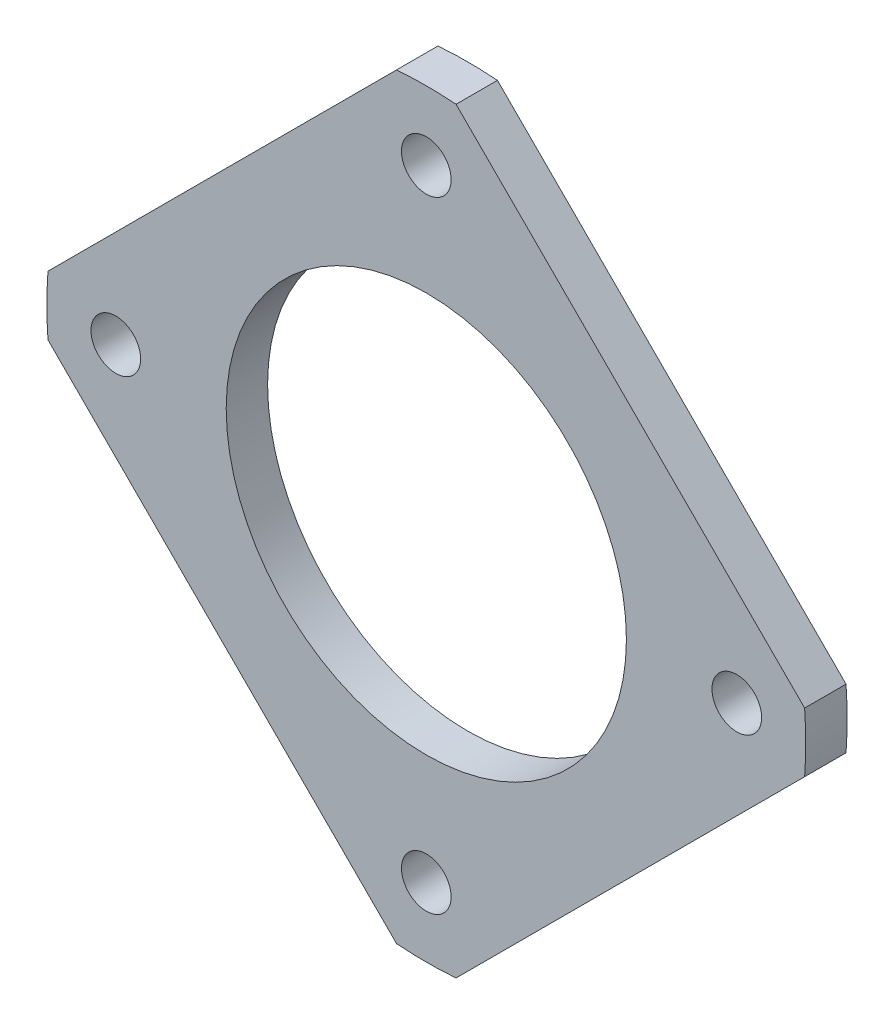
ISO-10303-21;
HEADER;
FILE_DESCRIPTION(('STEP AP214'),'2;1');
FILE_NAME('part.step','',(''),(''),'','','');
FILE_SCHEMA(('AUTOMOTIVE_DESIGN { 1 0 10303 214 1 1 1 1 }'));
ENDSEC;
DATA;
#1=APPLICATION_CONTEXT('core data for automotive mechanical design processes');
#2=APPLICATION_PROTOCOL_DEFINITION('international standard','automotive_design',2000,#1);
#3=PRODUCT_CONTEXT('',#1,'mechanical');
#4=PRODUCT('Part','Part','',(#3));
#5=PRODUCT_RELATED_PRODUCT_CATEGORY('part','',(#4));
#6=PRODUCT_DEFINITION_FORMATION('','',#4);
#7=PRODUCT_DEFINITION_CONTEXT('part definition',#1,'design');
#8=PRODUCT_DEFINITION('design','',#6,#7);
#9=PRODUCT_DEFINITION_SHAPE('','',#8);
#10=(LENGTH_UNIT() NAMED_UNIT(*) SI_UNIT(.MILLI.,.METRE.));
#11=(NAMED_UNIT(*) PLANE_ANGLE_UNIT() SI_UNIT($,.RADIAN.));
#12=(NAMED_UNIT(*) SI_UNIT($,.STERADIAN.) SOLID_ANGLE_UNIT());
#13=UNCERTAINTY_MEASURE_WITH_UNIT(LENGTH_MEASURE(1.E-05),#10,'distance_accuracy_value','');
#14=(GEOMETRIC_REPRESENTATION_CONTEXT(3) GLOBAL_UNCERTAINTY_ASSIGNED_CONTEXT((#13)) GLOBAL_UNIT_ASSIGNED_CONTEXT((#10,
#11,#12)) REPRESENTATION_CONTEXT('',''));
#15=CARTESIAN_POINT('',(0.,0.,0.));
#16=DIRECTION('',(0.,0.,1.));
#17=DIRECTION('',(1.,0.,0.));
#18=AXIS2_PLACEMENT_3D('',#15,#16,#17);
#19=CARTESIAN_POINT('',(0.,0.,3.));
#20=DIRECTION('',(0.,0.,-1.));
#21=DIRECTION('',(-1.,0.,0.));
#22=AXIS2_PLACEMENT_3D('',#19,#20,#21);
#23=CYLINDRICAL_SURFACE('',#22,27.5);
#24=CARTESIAN_POINT('',(0.,0.,3.));
#25=DIRECTION('',(0.,0.,1.));
#26=DIRECTION('',(1.,0.,0.));
#27=AXIS2_PLACEMENT_3D('',#24,#25,#26);
#28=CIRCLE('',#27,27.5);
#29=CARTESIAN_POINT('',(-2.15568881121761,-27.4153790006484,3.));
#30=VERTEX_POINT('',#29);
#31=CARTESIAN_POINT('',(2.15568881121849,-27.4153790006483,3.));
#32=VERTEX_POINT('',#31);
#33=EDGE_CURVE('E130',#30,#32,#28,.T.);
#34=ORIENTED_EDGE('',*,*,#33,.F.);
#35=DIRECTION('',(0.,0.,-1.));
#36=VECTOR('',#35,1.);
#37=CARTESIAN_POINT('',(-2.15568881121761,-27.4153790006484,3.));
#38=LINE('',#37,#36);
#39=CARTESIAN_POINT('',(-2.15568881121761,-27.4153790006484,0.));
#40=VERTEX_POINT('',#39);
#41=EDGE_CURVE('E11',#30,#40,#38,.T.);
#42=ORIENTED_EDGE('',*,*,#41,.T.);
#43=CARTESIAN_POINT('',(0.,0.,0.));
#44=DIRECTION('',(0.,0.,1.));
#45=DIRECTION('',(1.,0.,0.));
#46=AXIS2_PLACEMENT_3D('',#43,#44,#45);
#47=CIRCLE('',#46,27.5);
#48=CARTESIAN_POINT('',(2.15568881121849,-27.4153790006483,0.));
#49=VERTEX_POINT('',#48);
#50=EDGE_CURVE('E138',#40,#49,#47,.T.);
#51=ORIENTED_EDGE('',*,*,#50,.T.);
#52=DIRECTION('',(0.,0.,-1.));
#53=VECTOR('',#52,1.);
#54=CARTESIAN_POINT('',(2.15568881121849,-27.4153790006483,3.));
#55=LINE('',#54,#53);
#56=EDGE_CURVE('E108',#49,#32,#55,.F.);
#57=ORIENTED_EDGE('',*,*,#56,.T.);
#58=EDGE_LOOP('',(#34,#42,#51,#57));
#59=FACE_BOUND('',#58,.T.);
#60=ADVANCED_FACE('F33',(#59),#23,.T.);
#61=CARTESIAN_POINT('',(27.4153790006483,-2.155688811218,3.));
#62=VERTEX_POINT('',#61);
#63=CARTESIAN_POINT('',(27.4153790006484,2.1556888112175,3.));
#64=VERTEX_POINT('',#63);
#65=EDGE_CURVE('E119',#62,#64,#28,.T.);
#66=ORIENTED_EDGE('',*,*,#65,.F.);
#67=DIRECTION('',(0.,0.,-1.));
#68=VECTOR('',#67,1.);
#69=CARTESIAN_POINT('',(27.4153790006483,-2.155688811218,3.));
#70=LINE('',#69,#68);
#71=CARTESIAN_POINT('',(27.4153790006483,-2.155688811218,0.));
#72=VERTEX_POINT('',#71);
#73=EDGE_CURVE('E298',#62,#72,#70,.T.);
#74=ORIENTED_EDGE('',*,*,#73,.T.);
#75=CARTESIAN_POINT('',(27.4153790006484,2.1556888112175,0.));
#76=VERTEX_POINT('',#75);
#77=EDGE_CURVE('E136',#72,#76,#47,.T.);
#78=ORIENTED_EDGE('',*,*,#77,.T.);
#79=DIRECTION('',(0.,0.,-1.));
#80=VECTOR('',#79,1.);
#81=CARTESIAN_POINT('',(27.4153790006484,2.1556888112175,3.));
#82=LINE('',#81,#80);
#83=EDGE_CURVE('E109',#76,#64,#82,.F.);
#84=ORIENTED_EDGE('',*,*,#83,.T.);
#85=EDGE_LOOP('',(#66,#74,#78,#84));
#86=FACE_BOUND('',#85,.T.);
#87=ADVANCED_FACE('F220',(#86),#23,.T.);
#88=CARTESIAN_POINT('',(2.15568881121705,27.4153790006484,3.));
#89=VERTEX_POINT('',#88);
#90=CARTESIAN_POINT('',(-2.15568881121709,27.4153790006484,3.));
#91=VERTEX_POINT('',#90);
#92=EDGE_CURVE('E117',#89,#91,#28,.T.);
#93=ORIENTED_EDGE('',*,*,#92,.F.);
#94=DIRECTION('',(0.,0.,-1.));
#95=VECTOR('',#94,1.);
#96=CARTESIAN_POINT('',(2.15568881121705,27.4153790006484,3.));
#97=LINE('',#96,#95);
#98=CARTESIAN_POINT('',(2.15568881121705,27.4153790006484,0.));
#99=VERTEX_POINT('',#98);
#100=EDGE_CURVE('E97',#89,#99,#97,.T.);
#101=ORIENTED_EDGE('',*,*,#100,.T.);
#102=CARTESIAN_POINT('',(-2.15568881121709,27.4153790006484,0.));
#103=VERTEX_POINT('',#102);
#104=EDGE_CURVE('E133',#99,#103,#47,.T.);
#105=ORIENTED_EDGE('',*,*,#104,.T.);
#106=DIRECTION('',(0.,0.,-1.));
#107=VECTOR('',#106,1.);
#108=CARTESIAN_POINT('',(-2.15568881121709,27.4153790006484,3.));
#109=LINE('',#108,#107);
#110=EDGE_CURVE('E124',#103,#91,#109,.F.);
#111=ORIENTED_EDGE('',*,*,#110,.T.);
#112=EDGE_LOOP('',(#93,#101,#105,#111));
#113=FACE_BOUND('',#112,.T.);
#114=ADVANCED_FACE('F123',(#113),#23,.T.);
#115=CARTESIAN_POINT('',(0.,0.,3.));
#116=DIRECTION('',(0.,0.,1.));
#117=DIRECTION('',(1.,0.,0.));
#118=AXIS2_PLACEMENT_3D('',#115,#116,#117);
#119=PLANE('',#118);
#120=CARTESIAN_POINT('',(0.,22.5,3.));
#121=DIRECTION('',(0.,0.,1.));
#122=DIRECTION('',(1.,0.,0.));
#123=AXIS2_PLACEMENT_3D('',#120,#121,#122);
#124=CIRCLE('',#123,1.8);
#125=CARTESIAN_POINT('',(1.8,22.5,3.));
#126=VERTEX_POINT('',#125);
#127=EDGE_CURVE('E186',#126,#126,#124,.T.);
#128=ORIENTED_EDGE('',*,*,#127,.F.);
#129=EDGE_LOOP('',(#128));
#130=FACE_BOUND('',#129,.T.);
#131=CARTESIAN_POINT('',(-22.4999999999994,-6.38110734535049E-13,3.));
#132=DIRECTION('',(0.,0.,1.));
#133=DIRECTION('',(1.,0.,0.));
#134=AXIS2_PLACEMENT_3D('',#131,#132,#133);
#135=CIRCLE('',#134,1.8);
#136=CARTESIAN_POINT('',(-20.6999999999994,-6.38110734535049E-13,3.));
#137=VERTEX_POINT('',#136);
#138=EDGE_CURVE('E180',#137,#137,#135,.T.);
#139=ORIENTED_EDGE('',*,*,#138,.F.);
#140=EDGE_LOOP('',(#139));
#141=FACE_BOUND('',#140,.T.);
#142=CARTESIAN_POINT('',(1.27071055847394E-12,-22.5,3.));
#143=DIRECTION('',(0.,0.,1.));
#144=DIRECTION('',(1.,0.,0.));
#145=AXIS2_PLACEMENT_3D('',#142,#143,#144);
#146=CIRCLE('',#145,1.8);
#147=CARTESIAN_POINT('',(1.80000000000127,-22.5,3.));
#148=VERTEX_POINT('',#147);
#149=EDGE_CURVE('E174',#148,#148,#146,.T.);
#150=ORIENTED_EDGE('',*,*,#149,.F.);
#151=EDGE_LOOP('',(#150));
#152=FACE_BOUND('',#151,.T.);
#153=CARTESIAN_POINT('',(22.5000000000006,6.35355279236968E-13,3.));
#154=DIRECTION('',(0.,0.,1.));
#155=DIRECTION('',(1.,0.,0.));
#156=AXIS2_PLACEMENT_3D('',#153,#154,#155);
#157=CIRCLE('',#156,1.8);
#158=CARTESIAN_POINT('',(24.3000000000006,6.35355279236968E-13,3.));
#159=VERTEX_POINT('',#158);
#160=EDGE_CURVE('E168',#159,#159,#157,.T.);
#161=ORIENTED_EDGE('',*,*,#160,.F.);
#162=EDGE_LOOP('',(#161));
#163=FACE_BOUND('',#162,.T.);
#164=DIRECTION('',(-0.707106781186554,0.707106781186541,0.));
#165=VECTOR('',#164,1.);
#166=CARTESIAN_POINT('',(-14.785533905933,-14.7855339059332,3.));
#167=LINE('',#166,#165);
#168=CARTESIAN_POINT('',(-27.4153790006483,-2.15568881121808,3.));
#169=VERTEX_POINT('',#168);
#170=EDGE_CURVE('E56',#30,#169,#167,.T.);
#171=ORIENTED_EDGE('',*,*,#170,.F.);
#172=ORIENTED_EDGE('',*,*,#33,.T.);
#173=DIRECTION('',(-0.707106781186541,-0.707106781186554,0.));
#174=VECTOR('',#173,1.);
#175=CARTESIAN_POINT('',(14.7855339059334,-14.7855339059331,3.));
#176=LINE('',#175,#174);
#177=EDGE_CURVE('E48',#62,#32,#176,.T.);
#178=ORIENTED_EDGE('',*,*,#177,.F.);
#179=ORIENTED_EDGE('',*,*,#65,.T.);
#180=DIRECTION('',(0.707106781186553,-0.707106781186542,0.));
#181=VECTOR('',#180,1.);
#182=CARTESIAN_POINT('',(14.7855339059327,14.785533905933,3.));
#183=LINE('',#182,#181);
#184=EDGE_CURVE('E100',#89,#64,#183,.T.);
#185=ORIENTED_EDGE('',*,*,#184,.F.);
#186=ORIENTED_EDGE('',*,*,#92,.T.);
#187=DIRECTION('',(0.707106781186542,0.707106781186553,0.));
#188=VECTOR('',#187,1.);
#189=CARTESIAN_POINT('',(-14.7855339059328,14.7855339059325,3.));
#190=LINE('',#189,#188);
#191=CARTESIAN_POINT('',(-27.4153790006484,2.15568881121663,3.));
#192=VERTEX_POINT('',#191);
#193=EDGE_CURVE('E120',#192,#91,#190,.T.);
#194=ORIENTED_EDGE('',*,*,#193,.F.);
#195=EDGE_CURVE('E125',#192,#169,#28,.T.);
#196=ORIENTED_EDGE('',*,*,#195,.T.);
#197=EDGE_LOOP('',(#171,#172,#178,#179,#185,#186,#194,#196));
#198=FACE_BOUND('',#197,.T.);
#199=CARTESIAN_POINT('',(0.,0.,3.));
#200=DIRECTION('',(0.,0.,1.));
#201=DIRECTION('',(1.,0.,0.));
#202=AXIS2_PLACEMENT_3D('',#199,#200,#201);
#203=CIRCLE('',#202,14.5);
#204=CARTESIAN_POINT('',(14.5,0.,3.));
#205=VERTEX_POINT('',#204);
#206=EDGE_CURVE('E140',#205,#205,#203,.T.);
#207=ORIENTED_EDGE('',*,*,#206,.F.);
#208=EDGE_LOOP('',(#207));
#209=FACE_BOUND('',#208,.T.);
#210=ADVANCED_FACE('F114',(#130,#141,#152,#163,#198,#209),#119,.T.);
#211=CARTESIAN_POINT('',(0.,0.,0.));
#212=DIRECTION('',(0.,0.,1.));
#213=DIRECTION('',(1.,0.,0.));
#214=AXIS2_PLACEMENT_3D('',#211,#212,#213);
#215=PLANE('',#214);
#216=CARTESIAN_POINT('',(0.,22.5,0.));
#217=DIRECTION('',(0.,0.,1.));
#218=DIRECTION('',(1.,0.,0.));
#219=AXIS2_PLACEMENT_3D('',#216,#217,#218);
#220=CIRCLE('',#219,1.8);
#221=CARTESIAN_POINT('',(1.8,22.5,0.));
#222=VERTEX_POINT('',#221);
#223=EDGE_CURVE('E183',#222,#222,#220,.T.);
#224=ORIENTED_EDGE('',*,*,#223,.T.);
#225=EDGE_LOOP('',(#224));
#226=FACE_BOUND('',#225,.T.);
#227=CARTESIAN_POINT('',(-22.4999999999994,-6.38110734535049E-13,0.));
#228=DIRECTION('',(0.,0.,1.));
#229=DIRECTION('',(1.,0.,0.));
#230=AXIS2_PLACEMENT_3D('',#227,#228,#229);
#231=CIRCLE('',#230,1.8);
#232=CARTESIAN_POINT('',(-20.6999999999994,-6.38110734535049E-13,0.));
#233=VERTEX_POINT('',#232);
#234=EDGE_CURVE('E177',#233,#233,#231,.T.);
#235=ORIENTED_EDGE('',*,*,#234,.T.);
#236=EDGE_LOOP('',(#235));
#237=FACE_BOUND('',#236,.T.);
#238=CARTESIAN_POINT('',(1.27071055847394E-12,-22.5,0.));
#239=DIRECTION('',(0.,0.,1.));
#240=DIRECTION('',(1.,0.,0.));
#241=AXIS2_PLACEMENT_3D('',#238,#239,#240);
#242=CIRCLE('',#241,1.8);
#243=CARTESIAN_POINT('',(1.80000000000127,-22.5,0.));
#244=VERTEX_POINT('',#243);
#245=EDGE_CURVE('E171',#244,#244,#242,.T.);
#246=ORIENTED_EDGE('',*,*,#245,.T.);
#247=EDGE_LOOP('',(#246));
#248=FACE_BOUND('',#247,.T.);
#249=CARTESIAN_POINT('',(22.5000000000006,6.35355279236968E-13,0.));
#250=DIRECTION('',(0.,0.,1.));
#251=DIRECTION('',(1.,0.,0.));
#252=AXIS2_PLACEMENT_3D('',#249,#250,#251);
#253=CIRCLE('',#252,1.8);
#254=CARTESIAN_POINT('',(24.3000000000006,6.35355279236968E-13,0.));
#255=VERTEX_POINT('',#254);
#256=EDGE_CURVE('E164',#255,#255,#253,.T.);
#257=ORIENTED_EDGE('',*,*,#256,.T.);
#258=EDGE_LOOP('',(#257));
#259=FACE_BOUND('',#258,.T.);
#260=ORIENTED_EDGE('',*,*,#50,.F.);
#261=DIRECTION('',(-0.707106781186554,0.707106781186541,0.));
#262=VECTOR('',#261,1.);
#263=CARTESIAN_POINT('',(-14.785533905933,-14.7855339059332,0.));
#264=LINE('',#263,#262);
#265=CARTESIAN_POINT('',(-27.4153790006483,-2.15568881121808,0.));
#266=VERTEX_POINT('',#265);
#267=EDGE_CURVE('E151',#40,#266,#264,.T.);
#268=ORIENTED_EDGE('',*,*,#267,.T.);
#269=CARTESIAN_POINT('',(-27.4153790006484,2.15568881121663,0.));
#270=VERTEX_POINT('',#269);
#271=EDGE_CURVE('E135',#270,#266,#47,.T.);
#272=ORIENTED_EDGE('',*,*,#271,.F.);
#273=DIRECTION('',(0.707106781186542,0.707106781186553,0.));
#274=VECTOR('',#273,1.);
#275=CARTESIAN_POINT('',(-14.7855339059328,14.7855339059325,0.));
#276=LINE('',#275,#274);
#277=EDGE_CURVE('E159',#270,#103,#276,.T.);
#278=ORIENTED_EDGE('',*,*,#277,.T.);
#279=ORIENTED_EDGE('',*,*,#104,.F.);
#280=DIRECTION('',(0.707106781186553,-0.707106781186542,0.));
#281=VECTOR('',#280,1.);
#282=CARTESIAN_POINT('',(14.7855339059327,14.785533905933,0.));
#283=LINE('',#282,#281);
#284=EDGE_CURVE('E103',#99,#76,#283,.T.);
#285=ORIENTED_EDGE('',*,*,#284,.T.);
#286=ORIENTED_EDGE('',*,*,#77,.F.);
#287=DIRECTION('',(-0.707106781186541,-0.707106781186554,0.));
#288=VECTOR('',#287,1.);
#289=CARTESIAN_POINT('',(14.7855339059334,-14.7855339059331,0.));
#290=LINE('',#289,#288);
#291=EDGE_CURVE('E155',#72,#49,#290,.T.);
#292=ORIENTED_EDGE('',*,*,#291,.T.);
#293=EDGE_LOOP('',(#260,#268,#272,#278,#279,#285,#286,#292));
#294=FACE_BOUND('',#293,.T.);
#295=CARTESIAN_POINT('',(0.,0.,0.));
#296=DIRECTION('',(0.,0.,1.));
#297=DIRECTION('',(1.,0.,0.));
#298=AXIS2_PLACEMENT_3D('',#295,#296,#297);
#299=CIRCLE('',#298,14.5);
#300=CARTESIAN_POINT('',(14.5,0.,0.));
#301=VERTEX_POINT('',#300);
#302=EDGE_CURVE('E146',#301,#301,#299,.T.);
#303=ORIENTED_EDGE('',*,*,#302,.T.);
#304=EDGE_LOOP('',(#303));
#305=FACE_BOUND('',#304,.T.);
#306=ADVANCED_FACE('F194',(#226,#237,#248,#259,#294,#305),#215,.F.);
#307=ORIENTED_EDGE('',*,*,#271,.T.);
#308=DIRECTION('',(0.,0.,-1.));
#309=VECTOR('',#308,1.);
#310=CARTESIAN_POINT('',(-27.4153790006483,-2.15568881121808,3.));
#311=LINE('',#310,#309);
#312=EDGE_CURVE('E41',#266,#169,#311,.F.);
#313=ORIENTED_EDGE('',*,*,#312,.T.);
#314=ORIENTED_EDGE('',*,*,#195,.F.);
#315=DIRECTION('',(0.,0.,-1.));
#316=VECTOR('',#315,1.);
#317=CARTESIAN_POINT('',(-27.4153790006484,2.15568881121663,3.));
#318=LINE('',#317,#316);
#319=EDGE_CURVE('E127',#192,#270,#318,.T.);
#320=ORIENTED_EDGE('',*,*,#319,.T.);
#321=EDGE_LOOP('',(#307,#313,#314,#320));
#322=FACE_BOUND('',#321,.T.);
#323=ADVANCED_FACE('F35',(#322),#23,.T.);
#324=CARTESIAN_POINT('',(0.,0.,3.));
#325=DIRECTION('',(0.,0.,-1.));
#326=DIRECTION('',(-1.,0.,0.));
#327=AXIS2_PLACEMENT_3D('',#324,#325,#326);
#328=CYLINDRICAL_SURFACE('',#327,14.5);
#329=ORIENTED_EDGE('',*,*,#206,.T.);
#330=EDGE_LOOP('',(#329));
#331=FACE_BOUND('',#330,.T.);
#332=ORIENTED_EDGE('',*,*,#302,.F.);
#333=EDGE_LOOP('',(#332));
#334=FACE_BOUND('',#333,.T.);
#335=ADVANCED_FACE('F227',(#331,#334),#328,.F.);
#336=CARTESIAN_POINT('',(-14.7855339059328,14.7855339059325,-7.));
#337=DIRECTION('',(0.707106781186553,-0.707106781186542,0.));
#338=DIRECTION('',(0.707106781186542,0.707106781186553,0.));
#339=AXIS2_PLACEMENT_3D('',#336,#337,#338);
#340=PLANE('',#339);
#341=ORIENTED_EDGE('',*,*,#319,.F.);
#342=ORIENTED_EDGE('',*,*,#193,.T.);
#343=ORIENTED_EDGE('',*,*,#110,.F.);
#344=ORIENTED_EDGE('',*,*,#277,.F.);
#345=EDGE_LOOP('',(#341,#342,#343,#344));
#346=FACE_BOUND('',#345,.T.);
#347=ADVANCED_FACE('F233',(#346),#340,.F.);
#348=CARTESIAN_POINT('',(14.7855339059327,14.785533905933,-7.));
#349=DIRECTION('',(-0.707106781186542,-0.707106781186553,0.));
#350=DIRECTION('',(0.707106781186553,-0.707106781186542,0.));
#351=AXIS2_PLACEMENT_3D('',#348,#349,#350);
#352=PLANE('',#351);
#353=ORIENTED_EDGE('',*,*,#100,.F.);
#354=ORIENTED_EDGE('',*,*,#184,.T.);
#355=ORIENTED_EDGE('',*,*,#83,.F.);
#356=ORIENTED_EDGE('',*,*,#284,.F.);
#357=EDGE_LOOP('',(#353,#354,#355,#356));
#358=FACE_BOUND('',#357,.T.);
#359=ADVANCED_FACE('F99',(#358),#352,.F.);
#360=CARTESIAN_POINT('',(14.7855339059334,-14.7855339059331,-7.));
#361=DIRECTION('',(-0.707106781186554,0.707106781186541,0.));
#362=DIRECTION('',(-0.707106781186541,-0.707106781186554,0.));
#363=AXIS2_PLACEMENT_3D('',#360,#361,#362);
#364=PLANE('',#363);
#365=ORIENTED_EDGE('',*,*,#73,.F.);
#366=ORIENTED_EDGE('',*,*,#177,.T.);
#367=ORIENTED_EDGE('',*,*,#56,.F.);
#368=ORIENTED_EDGE('',*,*,#291,.F.);
#369=EDGE_LOOP('',(#365,#366,#367,#368));
#370=FACE_BOUND('',#369,.T.);
#371=ADVANCED_FACE('F215',(#370),#364,.F.);
#372=CARTESIAN_POINT('',(-14.785533905933,-14.7855339059332,-7.));
#373=DIRECTION('',(0.707106781186541,0.707106781186554,0.));
#374=DIRECTION('',(-0.707106781186554,0.707106781186541,0.));
#375=AXIS2_PLACEMENT_3D('',#372,#373,#374);
#376=PLANE('',#375);
#377=ORIENTED_EDGE('',*,*,#41,.F.);
#378=ORIENTED_EDGE('',*,*,#170,.T.);
#379=ORIENTED_EDGE('',*,*,#312,.F.);
#380=ORIENTED_EDGE('',*,*,#267,.F.);
#381=EDGE_LOOP('',(#377,#378,#379,#380));
#382=FACE_BOUND('',#381,.T.);
#383=ADVANCED_FACE('F205',(#382),#376,.F.);
#384=CARTESIAN_POINT('',(22.5000000000006,6.35355279236968E-13,3.));
#385=DIRECTION('',(0.,0.,1.));
#386=DIRECTION('',(1.,0.,0.));
#387=AXIS2_PLACEMENT_3D('',#384,#385,#386);
#388=CYLINDRICAL_SURFACE('',#387,1.8);
#389=ORIENTED_EDGE('',*,*,#256,.F.);
#390=EDGE_LOOP('',(#389));
#391=FACE_BOUND('',#390,.T.);
#392=ORIENTED_EDGE('',*,*,#160,.T.);
#393=EDGE_LOOP('',(#392));
#394=FACE_BOUND('',#393,.T.);
#395=ADVANCED_FACE('F202',(#391,#394),#388,.F.);
#396=CARTESIAN_POINT('',(1.27071055847394E-12,-22.5,3.));
#397=DIRECTION('',(0.,0.,1.));
#398=DIRECTION('',(1.,0.,0.));
#399=AXIS2_PLACEMENT_3D('',#396,#397,#398);
#400=CYLINDRICAL_SURFACE('',#399,1.8);
#401=ORIENTED_EDGE('',*,*,#245,.F.);
#402=EDGE_LOOP('',(#401));
#403=FACE_BOUND('',#402,.T.);
#404=ORIENTED_EDGE('',*,*,#149,.T.);
#405=EDGE_LOOP('',(#404));
#406=FACE_BOUND('',#405,.T.);
#407=ADVANCED_FACE('F204',(#403,#406),#400,.F.);
#408=CARTESIAN_POINT('',(-22.4999999999994,-6.38110734535049E-13,3.));
#409=DIRECTION('',(0.,0.,1.));
#410=DIRECTION('',(1.,0.,0.));
#411=AXIS2_PLACEMENT_3D('',#408,#409,#410);
#412=CYLINDRICAL_SURFACE('',#411,1.8);
#413=ORIENTED_EDGE('',*,*,#234,.F.);
#414=EDGE_LOOP('',(#413));
#415=FACE_BOUND('',#414,.T.);
#416=ORIENTED_EDGE('',*,*,#138,.T.);
#417=EDGE_LOOP('',(#416));
#418=FACE_BOUND('',#417,.T.);
#419=ADVANCED_FACE('F212',(#415,#418),#412,.F.);
#420=CARTESIAN_POINT('',(0.,22.5,3.));
#421=DIRECTION('',(0.,0.,1.));
#422=DIRECTION('',(1.,0.,0.));
#423=AXIS2_PLACEMENT_3D('',#420,#421,#422);
#424=CYLINDRICAL_SURFACE('',#423,1.8);
#425=ORIENTED_EDGE('',*,*,#223,.F.);
#426=EDGE_LOOP('',(#425));
#427=FACE_BOUND('',#426,.T.);
#428=ORIENTED_EDGE('',*,*,#127,.T.);
#429=EDGE_LOOP('',(#428));
#430=FACE_BOUND('',#429,.T.);
#431=ADVANCED_FACE('F190',(#427,#430),#424,.F.);
#432=CLOSED_SHELL('',(#60,#87,#114,#210,#306,#323,#335,#347,#359,#371,#383,#395,#407,#419,#431));
#433=MANIFOLD_SOLID_BREP('B2',#432);
#434=ADVANCED_BREP_SHAPE_REPRESENTATION('',(#18,#433),#14);
#435=SHAPE_DEFINITION_REPRESENTATION(#9,#434);
ENDSEC;
END-ISO-10303-21;
